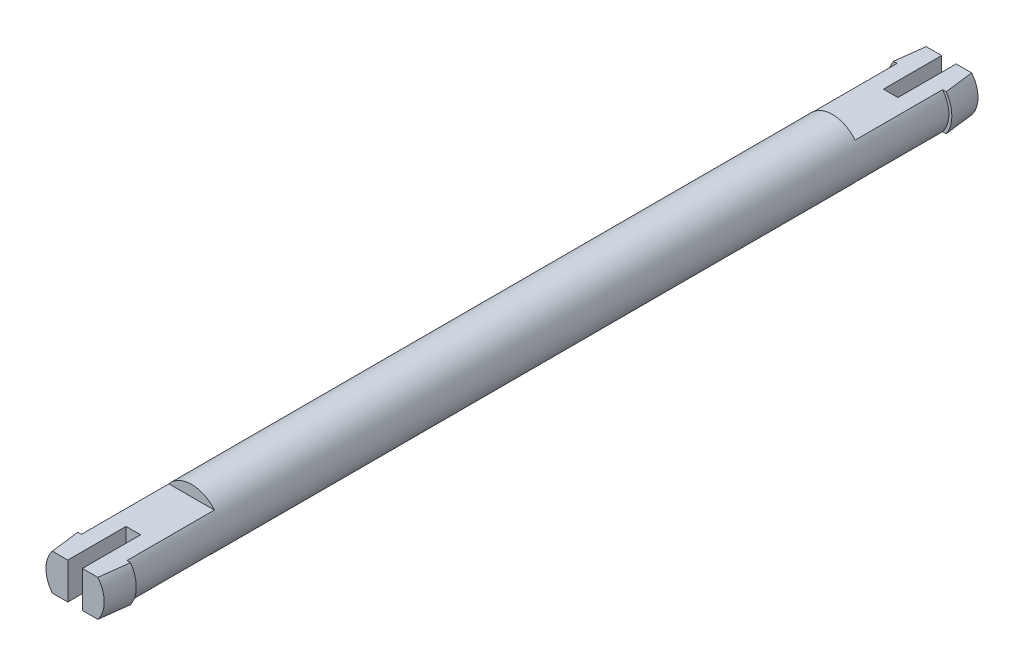
ISO-10303-21;
HEADER;
FILE_DESCRIPTION(('STEP AP214'),'2;1');
FILE_NAME('part.step','',(''),(''),'','','');
FILE_SCHEMA(('AUTOMOTIVE_DESIGN { 1 0 10303 214 1 1 1 1 }'));
ENDSEC;
DATA;
#1=APPLICATION_CONTEXT('core data for automotive mechanical design processes');
#2=APPLICATION_PROTOCOL_DEFINITION('international standard','automotive_design',2000,#1);
#3=PRODUCT_CONTEXT('',#1,'mechanical');
#4=PRODUCT('Part','Part','',(#3));
#5=PRODUCT_RELATED_PRODUCT_CATEGORY('part','',(#4));
#6=PRODUCT_DEFINITION_FORMATION('','',#4);
#7=PRODUCT_DEFINITION_CONTEXT('part definition',#1,'design');
#8=PRODUCT_DEFINITION('design','',#6,#7);
#9=PRODUCT_DEFINITION_SHAPE('','',#8);
#10=(LENGTH_UNIT() NAMED_UNIT(*) SI_UNIT(.MILLI.,.METRE.));
#11=(NAMED_UNIT(*) PLANE_ANGLE_UNIT() SI_UNIT($,.RADIAN.));
#12=(NAMED_UNIT(*) SI_UNIT($,.STERADIAN.) SOLID_ANGLE_UNIT());
#13=UNCERTAINTY_MEASURE_WITH_UNIT(LENGTH_MEASURE(1.E-05),#10,'distance_accuracy_value','');
#14=(GEOMETRIC_REPRESENTATION_CONTEXT(3) GLOBAL_UNCERTAINTY_ASSIGNED_CONTEXT((#13)) GLOBAL_UNIT_ASSIGNED_CONTEXT((#10,
#11,#12)) REPRESENTATION_CONTEXT('',''));
#15=CARTESIAN_POINT('',(0.,0.,0.));
#16=DIRECTION('',(0.,0.,1.));
#17=DIRECTION('',(1.,0.,0.));
#18=AXIS2_PLACEMENT_3D('',#15,#16,#17);
#19=CARTESIAN_POINT('',(0.,0.,-60.));
#20=DIRECTION('',(0.,0.,1.));
#21=DIRECTION('',(1.,0.,0.));
#22=AXIS2_PLACEMENT_3D('',#19,#20,#21);
#23=PLANE('',#22);
#24=DIRECTION('',(1.,0.,0.));
#25=VECTOR('',#24,1.);
#26=CARTESIAN_POINT('',(0.,1.25,-60.));
#27=LINE('',#26,#25);
#28=CARTESIAN_POINT('',(-1.5612494995996,1.25,-60.));
#29=VERTEX_POINT('',#28);
#30=CARTESIAN_POINT('',(-0.5,1.25,-60.));
#31=VERTEX_POINT('',#30);
#32=EDGE_CURVE('E420',#29,#31,#27,.T.);
#33=ORIENTED_EDGE('',*,*,#32,.T.);
#34=DIRECTION('',(0.,1.,0.));
#35=VECTOR('',#34,1.);
#36=CARTESIAN_POINT('',(-0.5,-2.,-60.));
#37=LINE('',#36,#35);
#38=CARTESIAN_POINT('',(-0.5,-1.25,-60.));
#39=VERTEX_POINT('',#38);
#40=EDGE_CURVE('E209',#39,#31,#37,.T.);
#41=ORIENTED_EDGE('',*,*,#40,.F.);
#42=DIRECTION('',(-1.,0.,0.));
#43=VECTOR('',#42,1.);
#44=CARTESIAN_POINT('',(0.,-1.25,-60.));
#45=LINE('',#44,#43);
#46=CARTESIAN_POINT('',(-1.5612494995996,-1.25,-60.));
#47=VERTEX_POINT('',#46);
#48=EDGE_CURVE('E62',#39,#47,#45,.T.);
#49=ORIENTED_EDGE('',*,*,#48,.T.);
#50=CARTESIAN_POINT('',(0.,0.,-60.));
#51=DIRECTION('',(0.,0.,1.));
#52=DIRECTION('',(1.,0.,0.));
#53=AXIS2_PLACEMENT_3D('',#50,#51,#52);
#54=CIRCLE('',#53,2.);
#55=EDGE_CURVE('E397',#29,#47,#54,.T.);
#56=ORIENTED_EDGE('',*,*,#55,.F.);
#57=EDGE_LOOP('',(#33,#41,#49,#56));
#58=FACE_BOUND('',#57,.T.);
#59=ADVANCED_FACE('F39',(#58),#23,.F.);
#60=CARTESIAN_POINT('',(0.,0.,-58.));
#61=DIRECTION('',(0.,0.,1.));
#62=DIRECTION('',(1.,0.,0.));
#63=AXIS2_PLACEMENT_3D('',#60,#61,#62);
#64=PLANE('',#63);
#65=DIRECTION('',(-1.,0.,0.));
#66=VECTOR('',#65,1.);
#67=CARTESIAN_POINT('',(0.,-1.25,-58.));
#68=LINE('',#67,#66);
#69=CARTESIAN_POINT('',(1.81038669902327,-1.25,-58.0000000000001));
#70=VERTEX_POINT('',#69);
#71=CARTESIAN_POINT('',(1.5612494995996,-1.25,-58.));
#72=VERTEX_POINT('',#71);
#73=EDGE_CURVE('E238',#70,#72,#68,.T.);
#74=ORIENTED_EDGE('',*,*,#73,.F.);
#75=CARTESIAN_POINT('',(0.,0.,-58.));
#76=DIRECTION('',(0.,0.,1.));
#77=DIRECTION('',(1.,0.,0.));
#78=AXIS2_PLACEMENT_3D('',#75,#76,#77);
#79=CIRCLE('',#78,2.2);
#80=CARTESIAN_POINT('',(1.81038669902327,1.25,-58.0000000000001));
#81=VERTEX_POINT('',#80);
#82=EDGE_CURVE('E291',#70,#81,#79,.T.);
#83=ORIENTED_EDGE('',*,*,#82,.T.);
#84=DIRECTION('',(1.,0.,0.));
#85=VECTOR('',#84,1.);
#86=CARTESIAN_POINT('',(0.,1.25,-58.));
#87=LINE('',#86,#85);
#88=CARTESIAN_POINT('',(1.5612494995996,1.25,-58.));
#89=VERTEX_POINT('',#88);
#90=EDGE_CURVE('E274',#89,#81,#87,.T.);
#91=ORIENTED_EDGE('',*,*,#90,.F.);
#92=CARTESIAN_POINT('',(0.,0.,-58.));
#93=DIRECTION('',(0.,0.,1.));
#94=DIRECTION('',(1.,0.,0.));
#95=AXIS2_PLACEMENT_3D('',#92,#93,#94);
#96=CIRCLE('',#95,2.);
#97=EDGE_CURVE('E417',#89,#72,#96,.F.);
#98=ORIENTED_EDGE('',*,*,#97,.T.);
#99=EDGE_LOOP('',(#74,#83,#91,#98));
#100=FACE_BOUND('',#99,.T.);
#101=ADVANCED_FACE('F461',(#100),#64,.T.);
#102=CARTESIAN_POINT('',(0.,0.,-58.));
#103=DIRECTION('',(0.,0.,1.));
#104=DIRECTION('',(1.,0.,0.));
#105=AXIS2_PLACEMENT_3D('',#102,#103,#104);
#106=CONICAL_SURFACE('',#105,2.2,0.0996686524911613);
#107=CARTESIAN_POINT('',(-2.07154781563105,-1.25,-55.8053511030935));
#108=CARTESIAN_POINT('',(-2.03550722726415,-1.25,-56.1139180179247));
#109=CARTESIAN_POINT('',(-1.99922295149764,-1.25,-56.4224563190549));
#110=CARTESIAN_POINT('',(-1.92607039278534,-1.25,-57.0394648246496));
#111=CARTESIAN_POINT('',(-1.88920210764817,-1.25,-57.3479350288541));
#112=CARTESIAN_POINT('',(-1.77758091435319,-1.25,-58.2731887554345));
#113=CARTESIAN_POINT('',(-1.70180760472734,-1.25,-58.889850372761));
#114=CARTESIAN_POINT('',(-1.58512147260779,-1.25,-59.8144760218349));
#115=CARTESIAN_POINT('',(-1.54572075887383,-1.25,-60.1226307817609));
#116=CARTESIAN_POINT('',(-1.46564062998624,-1.25,-60.73877265943));
#117=CARTESIAN_POINT('',(-1.42496122188892,-1.25,-61.0467597780885));
#118=CARTESIAN_POINT('',(-1.34198072748192,-1.25,-61.6625339402322));
#119=CARTESIAN_POINT('',(-1.29967955336675,-1.25,-61.9703209719642));
#120=CARTESIAN_POINT('',(-1.21285635248196,-1.25,-62.5855868834585));
#121=CARTESIAN_POINT('',(-1.16833428338409,-1.25,-62.8930657572336));
#122=CARTESIAN_POINT('',(-1.12240193199714,-1.25,-63.2003390005902));
#123=B_SPLINE_CURVE_WITH_KNOTS('',3,(#107,#108,#109,#110,#111,#112,#113,#114,#115,#116,#117,
#118,#119,#120,#121,#122),.UNSPECIFIED.,.F.,.F.,(4,2,2,2,2,2,2,4),(0.,0.931993165762316,
1.86398982945296,3.7278775087708,4.65986577266912,5.59184889439993,6.52388254692386,
7.45593396996271),.UNSPECIFIED.);
#124=CARTESIAN_POINT('',(-1.81038669902327,-1.25,-58.0000000000001));
#125=VERTEX_POINT('',#124);
#126=EDGE_CURVE('E255',#125,#47,#123,.T.);
#127=ORIENTED_EDGE('',*,*,#126,.F.);
#128=CARTESIAN_POINT('',(-1.81038669902327,1.25,-58.0000000000001));
#129=VERTEX_POINT('',#128);
#130=EDGE_CURVE('E292',#129,#125,#79,.T.);
#131=ORIENTED_EDGE('',*,*,#130,.F.);
#132=CARTESIAN_POINT('',(-1.12240193199714,1.25,-63.2003390005902));
#133=CARTESIAN_POINT('',(-1.16007318188192,1.25,-62.9484550212629));
#134=CARTESIAN_POINT('',(-1.19677568222069,1.25,-62.6964288561933));
#135=CARTESIAN_POINT('',(-1.26860770564258,1.25,-62.1921552657798));
#136=CARTESIAN_POINT('',(-1.30373724824444,1.25,-61.9399078432212));
#137=CARTESIAN_POINT('',(-1.37278762127905,1.25,-61.4352571718187));
#138=CARTESIAN_POINT('',(-1.40670849276505,1.25,-61.1828539285641));
#139=CARTESIAN_POINT('',(-1.47357063225507,1.25,-60.6779171395039));
#140=CARTESIAN_POINT('',(-1.50651189747343,1.25,-60.4253835933298));
#141=CARTESIAN_POINT('',(-1.56766910496902,1.25,-59.9506559350624));
#142=CARTESIAN_POINT('',(-1.59597605442952,1.25,-59.7284735200067));
#143=CARTESIAN_POINT('',(-1.66291250795864,1.25,-59.198043320873));
#144=CARTESIAN_POINT('',(-1.70129728585269,1.25,-58.8897646573885));
#145=CARTESIAN_POINT('',(-1.77723656698478,1.25,-58.2731045277543));
#146=CARTESIAN_POINT('',(-1.81479106820384,1.25,-57.9647230613564));
#147=CARTESIAN_POINT('',(-1.88921121609686,1.25,-57.3478817112025));
#148=CARTESIAN_POINT('',(-1.92607687286844,1.25,-57.0394218286632));
#149=CARTESIAN_POINT('',(-1.99922418459549,1.25,-56.4224342581659));
#150=CARTESIAN_POINT('',(-2.0355058422845,1.25,-56.1139065705321));
#151=CARTESIAN_POINT('',(-2.07154781563105,1.25,-55.8053511030935));
#152=B_SPLINE_CURVE_WITH_KNOTS('',3,(#132,#133,#134,#135,#136,#137,#138,#139,#140,#141,#142,
#143,#144,#145,#146,#147,#148,#149,#150,#151),.UNSPECIFIED.,.F.,.F.,(4,2,2,2,2,2,2,2,2,4),(0.,
0.764050536151596,1.52809158862137,2.29210666519175,3.05612391415669,3.72805834866274,
4.66003438385201,5.59201268506306,6.52397731386888,7.45593757911201),.UNSPECIFIED.);
#153=EDGE_CURVE('E281',#29,#129,#152,.T.);
#154=ORIENTED_EDGE('',*,*,#153,.F.);
#155=ORIENTED_EDGE('',*,*,#55,.T.);
#156=EDGE_LOOP('',(#127,#131,#154,#155));
#157=FACE_BOUND('',#156,.T.);
#158=ADVANCED_FACE('F465',(#157),#106,.T.);
#159=CARTESIAN_POINT('',(0.,0.,0.));
#160=DIRECTION('',(0.,0.,1.));
#161=DIRECTION('',(1.,0.,0.));
#162=AXIS2_PLACEMENT_3D('',#159,#160,#161);
#163=PLANE('',#162);
#164=DIRECTION('',(0.,-1.,0.));
#165=VECTOR('',#164,1.);
#166=CARTESIAN_POINT('',(-0.5,2.001,0.));
#167=LINE('',#166,#165);
#168=CARTESIAN_POINT('',(-0.5,1.25,0.));
#169=VERTEX_POINT('',#168);
#170=CARTESIAN_POINT('',(-0.5,-1.25,0.));
#171=VERTEX_POINT('',#170);
#172=EDGE_CURVE('E308',#169,#171,#167,.T.);
#173=ORIENTED_EDGE('',*,*,#172,.F.);
#174=DIRECTION('',(1.,0.,0.));
#175=VECTOR('',#174,1.);
#176=CARTESIAN_POINT('',(0.,1.25,0.));
#177=LINE('',#176,#175);
#178=CARTESIAN_POINT('',(-1.5612494995996,1.25,0.));
#179=VERTEX_POINT('',#178);
#180=EDGE_CURVE('E411',#179,#169,#177,.T.);
#181=ORIENTED_EDGE('',*,*,#180,.F.);
#182=CARTESIAN_POINT('',(0.,0.,0.));
#183=DIRECTION('',(0.,0.,1.));
#184=DIRECTION('',(1.,0.,0.));
#185=AXIS2_PLACEMENT_3D('',#182,#183,#184);
#186=CIRCLE('',#185,2.);
#187=CARTESIAN_POINT('',(-1.5612494995996,-1.25,0.));
#188=VERTEX_POINT('',#187);
#189=EDGE_CURVE('E392',#179,#188,#186,.T.);
#190=ORIENTED_EDGE('',*,*,#189,.T.);
#191=DIRECTION('',(-1.,0.,0.));
#192=VECTOR('',#191,1.);
#193=CARTESIAN_POINT('',(0.,-1.25,0.));
#194=LINE('',#193,#192);
#195=EDGE_CURVE('E404',#171,#188,#194,.T.);
#196=ORIENTED_EDGE('',*,*,#195,.F.);
#197=EDGE_LOOP('',(#173,#181,#190,#196));
#198=FACE_BOUND('',#197,.T.);
#199=ADVANCED_FACE('F476',(#198),#163,.T.);
#200=CARTESIAN_POINT('',(0.,0.,0.));
#201=DIRECTION('',(0.,0.,-1.));
#202=DIRECTION('',(-1.,0.,0.));
#203=AXIS2_PLACEMENT_3D('',#200,#201,#202);
#204=CONICAL_SURFACE('',#203,2.,0.0996686524911612);
#205=CARTESIAN_POINT('',(-2.20629085167544,1.25,-5.35787712366069));
#206=CARTESIAN_POINT('',(-2.16911364127435,1.25,-5.03442418142203));
#207=CARTESIAN_POINT('',(-2.13171451989948,1.25,-4.71099685663596));
#208=CARTESIAN_POINT('',(-2.05638780976397,1.25,-4.06420290953939));
#209=CARTESIAN_POINT('',(-2.01846021960565,1.25,-3.74083628739171));
#210=CARTESIAN_POINT('',(-1.90376109024389,1.25,-2.77086975377676));
#211=CARTESIAN_POINT('',(-1.82607027221003,1.25,-2.12437765306016));
#212=CARTESIAN_POINT('',(-1.70685435031514,1.25,-1.15495865945316));
#213=CARTESIAN_POINT('',(-1.6666684414073,1.25,-0.831867113806437));
#214=CARTESIAN_POINT('',(-1.58517894557185,1.25,-0.185825927060357));
#215=CARTESIAN_POINT('',(-1.54387536251856,1.25,0.137123714526958));
#216=CARTESIAN_POINT('',(-1.45986916908057,1.25,0.782854266012029));
#217=CARTESIAN_POINT('',(-1.41716650618307,1.25,1.10563516911336));
#218=CARTESIAN_POINT('',(-1.32989270639121,1.25,1.75094775860943));
#219=CARTESIAN_POINT('',(-1.28532154707356,1.25,2.07347944196603));
#220=CARTESIAN_POINT('',(-1.23958118370651,1.25,2.39584846975234));
#221=B_SPLINE_CURVE_WITH_KNOTS('',3,(#205,#206,#207,#208,#209,#210,#211,#212,#213,#214,#215,
#216,#217,#218,#219,#220),.UNSPECIFIED.,.F.,.F.,(4,2,2,2,2,2,2,4),(0.,0.976747065340103,
1.95349671443936,3.90691894725974,4.88366075798535,5.86039918335277,6.83717431153944,
7.81396116508773),.UNSPECIFIED.);
#222=CARTESIAN_POINT('',(-1.81038669902317,1.25,-2.));
#223=VERTEX_POINT('',#222);
#224=EDGE_CURVE('E324',#223,#179,#221,.T.);
#225=ORIENTED_EDGE('',*,*,#224,.F.);
#226=CARTESIAN_POINT('',(0.,0.,-2.));
#227=DIRECTION('',(0.,0.,1.));
#228=DIRECTION('',(1.,0.,0.));
#229=AXIS2_PLACEMENT_3D('',#226,#227,#228);
#230=CIRCLE('',#229,2.2);
#231=CARTESIAN_POINT('',(-1.81038669902317,-1.25,-2.));
#232=VERTEX_POINT('',#231);
#233=EDGE_CURVE('E388',#223,#232,#230,.T.);
#234=ORIENTED_EDGE('',*,*,#233,.T.);
#235=CARTESIAN_POINT('',(-1.23958118370651,-1.25,2.39584846975234));
#236=CARTESIAN_POINT('',(-1.27708445163936,-1.25,2.1316265009786));
#237=CARTESIAN_POINT('',(-1.31378723609279,-1.25,1.86729257599781));
#238=CARTESIAN_POINT('',(-1.38587498011765,-1.25,1.33844690886303));
#239=CARTESIAN_POINT('',(-1.42125994975576,-1.25,1.07393516808307));
#240=CARTESIAN_POINT('',(-1.49099498681418,-1.25,0.544781873474838));
#241=CARTESIAN_POINT('',(-1.5253450774814,-1.25,0.280140322698454));
#242=CARTESIAN_POINT('',(-1.59319606726225,-1.25,-0.249251984131472));
#243=CARTESIAN_POINT('',(-1.62669696491898,-1.25,-0.514002740371576));
#244=CARTESIAN_POINT('',(-1.68902097967955,-1.25,-1.01186777884924));
#245=CARTESIAN_POINT('',(-1.71792365975446,-1.25,-1.24497212268678));
#246=CARTESIAN_POINT('',(-1.8260728146173,-1.25,-2.12439276505839));
#247=CARTESIAN_POINT('',(-1.90376491575885,-1.25,-2.77090043818358));
#248=CARTESIAN_POINT('',(-2.01846468029956,-1.25,-3.74087483946421));
#249=CARTESIAN_POINT('',(-2.056391393145,-1.25,-4.06423386196728));
#250=CARTESIAN_POINT('',(-2.13171635303436,-1.25,-4.71101241305846));
#251=CARTESIAN_POINT('',(-2.16911460179215,-1.25,-5.03443194144689));
#252=CARTESIAN_POINT('',(-2.20629085167544,-1.25,-5.35787712366069));
#253=B_SPLINE_CURVE_WITH_KNOTS('',3,(#235,#236,#237,#238,#239,#240,#241,#242,#243,#244,#245,
#246,#247,#248,#249,#250,#251,#252),.UNSPECIFIED.,.F.,.F.,(4,2,2,2,2,2,2,2,4),(0.,
0.800607232202053,1.60120834737589,2.40179146488677,3.2023759557953,3.90704351295182,
5.86051217913123,6.83723890380335,7.81396246011894),.UNSPECIFIED.);
#254=EDGE_CURVE('E379',#188,#232,#253,.T.);
#255=ORIENTED_EDGE('',*,*,#254,.F.);
#256=ORIENTED_EDGE('',*,*,#189,.F.);
#257=EDGE_LOOP('',(#225,#234,#255,#256));
#258=FACE_BOUND('',#257,.T.);
#259=ADVANCED_FACE('F481',(#258),#204,.T.);
#260=CARTESIAN_POINT('',(0.,0.,-2.));
#261=DIRECTION('',(0.,0.,-1.));
#262=DIRECTION('',(-1.,0.,0.));
#263=AXIS2_PLACEMENT_3D('',#260,#261,#262);
#264=PLANE('',#263);
#265=DIRECTION('',(-1.,0.,0.));
#266=VECTOR('',#265,1.);
#267=CARTESIAN_POINT('',(0.,1.25,-2.));
#268=LINE('',#267,#266);
#269=CARTESIAN_POINT('',(1.81038669902317,1.25,-2.));
#270=VERTEX_POINT('',#269);
#271=CARTESIAN_POINT('',(1.5612494995996,1.25,-2.));
#272=VERTEX_POINT('',#271);
#273=EDGE_CURVE('E325',#270,#272,#268,.T.);
#274=ORIENTED_EDGE('',*,*,#273,.F.);
#275=CARTESIAN_POINT('',(1.81038669902317,-1.25,-2.));
#276=VERTEX_POINT('',#275);
#277=EDGE_CURVE('E389',#276,#270,#230,.T.);
#278=ORIENTED_EDGE('',*,*,#277,.F.);
#279=DIRECTION('',(1.,0.,0.));
#280=VECTOR('',#279,1.);
#281=CARTESIAN_POINT('',(0.,-1.25,-2.));
#282=LINE('',#281,#280);
#283=CARTESIAN_POINT('',(1.5612494995996,-1.25,-2.));
#284=VERTEX_POINT('',#283);
#285=EDGE_CURVE('E361',#284,#276,#282,.T.);
#286=ORIENTED_EDGE('',*,*,#285,.F.);
#287=CARTESIAN_POINT('',(0.,0.,-2.));
#288=DIRECTION('',(0.,0.,-1.));
#289=DIRECTION('',(-1.,0.,0.));
#290=AXIS2_PLACEMENT_3D('',#287,#288,#289);
#291=CIRCLE('',#290,2.);
#292=EDGE_CURVE('E401',#284,#272,#291,.F.);
#293=ORIENTED_EDGE('',*,*,#292,.T.);
#294=EDGE_LOOP('',(#274,#278,#286,#293));
#295=FACE_BOUND('',#294,.T.);
#296=ADVANCED_FACE('F562',(#295),#264,.T.);
#297=CARTESIAN_POINT('',(0.,0.,-60.));
#298=DIRECTION('',(0.,0.,1.));
#299=DIRECTION('',(1.,0.,0.));
#300=AXIS2_PLACEMENT_3D('',#297,#298,#299);
#301=CYLINDRICAL_SURFACE('',#300,2.);
#302=DIRECTION('',(0.,0.,1.));
#303=VECTOR('',#302,1.);
#304=CARTESIAN_POINT('',(-1.5612494995996,-1.25,-60.));
#305=LINE('',#304,#303);
#306=CARTESIAN_POINT('',(-1.5612494995996,-1.25,-52.));
#307=VERTEX_POINT('',#306);
#308=CARTESIAN_POINT('',(-1.5612494995996,-1.25,-58.));
#309=VERTEX_POINT('',#308);
#310=EDGE_CURVE('E263',#307,#309,#305,.F.);
#311=ORIENTED_EDGE('',*,*,#310,.F.);
#312=CARTESIAN_POINT('',(0.,0.,-52.));
#313=DIRECTION('',(0.,0.,-1.));
#314=DIRECTION('',(-1.,0.,0.));
#315=AXIS2_PLACEMENT_3D('',#312,#313,#314);
#316=CIRCLE('',#315,2.);
#317=CARTESIAN_POINT('',(1.5612494995996,-1.25,-52.));
#318=VERTEX_POINT('',#317);
#319=EDGE_CURVE('E428',#307,#318,#316,.F.);
#320=ORIENTED_EDGE('',*,*,#319,.T.);
#321=DIRECTION('',(0.,0.,1.));
#322=VECTOR('',#321,1.);
#323=CARTESIAN_POINT('',(1.5612494995996,-1.25,-60.));
#324=LINE('',#323,#322);
#325=EDGE_CURVE('E262',#72,#318,#324,.T.);
#326=ORIENTED_EDGE('',*,*,#325,.F.);
#327=ORIENTED_EDGE('',*,*,#97,.F.);
#328=DIRECTION('',(0.,0.,1.));
#329=VECTOR('',#328,1.);
#330=CARTESIAN_POINT('',(1.5612494995996,1.25,-60.));
#331=LINE('',#330,#329);
#332=CARTESIAN_POINT('',(1.5612494995996,1.25,-52.));
#333=VERTEX_POINT('',#332);
#334=EDGE_CURVE('E288',#333,#89,#331,.F.);
#335=ORIENTED_EDGE('',*,*,#334,.F.);
#336=CARTESIAN_POINT('',(0.,0.,-52.));
#337=DIRECTION('',(0.,0.,1.));
#338=DIRECTION('',(1.,0.,0.));
#339=AXIS2_PLACEMENT_3D('',#336,#337,#338);
#340=CIRCLE('',#339,2.);
#341=CARTESIAN_POINT('',(-1.5612494995996,1.25,-52.));
#342=VERTEX_POINT('',#341);
#343=EDGE_CURVE('E423',#342,#333,#340,.F.);
#344=ORIENTED_EDGE('',*,*,#343,.F.);
#345=DIRECTION('',(0.,0.,1.));
#346=VECTOR('',#345,1.);
#347=CARTESIAN_POINT('',(-1.5612494995996,1.25,-60.));
#348=LINE('',#347,#346);
#349=CARTESIAN_POINT('',(-1.5612494995996,1.25,-58.));
#350=VERTEX_POINT('',#349);
#351=EDGE_CURVE('E289',#350,#342,#348,.T.);
#352=ORIENTED_EDGE('',*,*,#351,.F.);
#353=EDGE_CURVE('E416',#309,#350,#96,.F.);
#354=ORIENTED_EDGE('',*,*,#353,.F.);
#355=EDGE_LOOP('',(#311,#320,#326,#327,#335,#344,#352,#354));
#356=FACE_BOUND('',#355,.T.);
#357=DIRECTION('',(0.,0.,1.));
#358=VECTOR('',#357,1.);
#359=CARTESIAN_POINT('',(1.5612494995996,1.25,-60.));
#360=LINE('',#359,#358);
#361=CARTESIAN_POINT('',(1.5612494995996,1.25,-8.));
#362=VERTEX_POINT('',#361);
#363=EDGE_CURVE('E356',#272,#362,#360,.F.);
#364=ORIENTED_EDGE('',*,*,#363,.F.);
#365=ORIENTED_EDGE('',*,*,#292,.F.);
#366=DIRECTION('',(0.,0.,1.));
#367=VECTOR('',#366,1.);
#368=CARTESIAN_POINT('',(1.5612494995996,-1.25,-60.));
#369=LINE('',#368,#367);
#370=CARTESIAN_POINT('',(1.5612494995996,-1.25,-8.));
#371=VERTEX_POINT('',#370);
#372=EDGE_CURVE('E370',#371,#284,#369,.T.);
#373=ORIENTED_EDGE('',*,*,#372,.F.);
#374=CARTESIAN_POINT('',(0.,0.,-8.));
#375=DIRECTION('',(0.,0.,-1.));
#376=DIRECTION('',(-1.,0.,0.));
#377=AXIS2_PLACEMENT_3D('',#374,#375,#376);
#378=CIRCLE('',#377,2.);
#379=CARTESIAN_POINT('',(-1.5612494995996,-1.25,-8.));
#380=VERTEX_POINT('',#379);
#381=EDGE_CURVE('E408',#380,#371,#378,.F.);
#382=ORIENTED_EDGE('',*,*,#381,.F.);
#383=DIRECTION('',(0.,0.,1.));
#384=VECTOR('',#383,1.);
#385=CARTESIAN_POINT('',(-1.5612494995996,-1.25,-60.));
#386=LINE('',#385,#384);
#387=CARTESIAN_POINT('',(-1.5612494995996,-1.25,-2.));
#388=VERTEX_POINT('',#387);
#389=EDGE_CURVE('E386',#388,#380,#386,.F.);
#390=ORIENTED_EDGE('',*,*,#389,.F.);
#391=CARTESIAN_POINT('',(-1.5612494995996,1.25,-2.));
#392=VERTEX_POINT('',#391);
#393=EDGE_CURVE('E400',#392,#388,#291,.F.);
#394=ORIENTED_EDGE('',*,*,#393,.F.);
#395=DIRECTION('',(0.,0.,1.));
#396=VECTOR('',#395,1.);
#397=CARTESIAN_POINT('',(-1.5612494995996,1.25,-60.));
#398=LINE('',#397,#396);
#399=CARTESIAN_POINT('',(-1.5612494995996,1.25,-8.));
#400=VERTEX_POINT('',#399);
#401=EDGE_CURVE('E333',#400,#392,#398,.T.);
#402=ORIENTED_EDGE('',*,*,#401,.F.);
#403=CARTESIAN_POINT('',(0.,0.,-8.));
#404=DIRECTION('',(0.,0.,-1.));
#405=DIRECTION('',(-1.,0.,0.));
#406=AXIS2_PLACEMENT_3D('',#403,#404,#405);
#407=CIRCLE('',#406,2.);
#408=EDGE_CURVE('E414',#362,#400,#407,.F.);
#409=ORIENTED_EDGE('',*,*,#408,.F.);
#410=EDGE_LOOP('',(#364,#365,#373,#382,#390,#394,#402,#409));
#411=FACE_BOUND('',#410,.T.);
#412=ADVANCED_FACE('F41',(#356,#411),#301,.T.);
#413=CARTESIAN_POINT('',(1.23958118370651,1.25,2.39584846975234));
#414=CARTESIAN_POINT('',(1.27708445163936,1.25,2.1316265009786));
#415=CARTESIAN_POINT('',(1.31378723609279,1.25,1.86729257599781));
#416=CARTESIAN_POINT('',(1.38587498011765,1.25,1.33844690886303));
#417=CARTESIAN_POINT('',(1.42125994975576,1.25,1.07393516808307));
#418=CARTESIAN_POINT('',(1.49099498681418,1.25,0.544781873474838));
#419=CARTESIAN_POINT('',(1.5253450774814,1.25,0.280140322698454));
#420=CARTESIAN_POINT('',(1.59319606726225,1.25,-0.249251984131472));
#421=CARTESIAN_POINT('',(1.62669696491898,1.25,-0.514002740371576));
#422=CARTESIAN_POINT('',(1.68902097967955,1.25,-1.01186777884924));
#423=CARTESIAN_POINT('',(1.71792365975446,1.25,-1.24497212268678));
#424=CARTESIAN_POINT('',(1.8260728146173,1.25,-2.12439276505839));
#425=CARTESIAN_POINT('',(1.90376491575885,1.25,-2.77090043818358));
#426=CARTESIAN_POINT('',(2.01846468029956,1.25,-3.74087483946421));
#427=CARTESIAN_POINT('',(2.056391393145,1.25,-4.06423386196728));
#428=CARTESIAN_POINT('',(2.13171635303436,1.25,-4.71101241305846));
#429=CARTESIAN_POINT('',(2.16911460179215,1.25,-5.03443194144689));
#430=CARTESIAN_POINT('',(2.20629085167544,1.25,-5.35787712366069));
#431=B_SPLINE_CURVE_WITH_KNOTS('',3,(#413,#414,#415,#416,#417,#418,#419,#420,#421,#422,#423,
#424,#425,#426,#427,#428,#429,#430),.UNSPECIFIED.,.F.,.F.,(4,2,2,2,2,2,2,2,4),(0.,
0.800607232202053,1.60120834737589,2.40179146488677,3.2023759557953,3.90704351295182,
5.86051217913123,6.83723890380335,7.81396246011894),.UNSPECIFIED.);
#432=CARTESIAN_POINT('',(1.5612494995996,1.25,0.));
#433=VERTEX_POINT('',#432);
#434=EDGE_CURVE('E350',#433,#270,#431,.T.);
#435=ORIENTED_EDGE('',*,*,#434,.F.);
#436=CARTESIAN_POINT('',(1.5612494995996,-1.25,0.));
#437=VERTEX_POINT('',#436);
#438=EDGE_CURVE('E393',#437,#433,#186,.T.);
#439=ORIENTED_EDGE('',*,*,#438,.F.);
#440=CARTESIAN_POINT('',(2.20629085167544,-1.25,-5.35787712366069));
#441=CARTESIAN_POINT('',(2.16911364127435,-1.25,-5.03442418142203));
#442=CARTESIAN_POINT('',(2.13171451989948,-1.25,-4.71099685663596));
#443=CARTESIAN_POINT('',(2.05638780976397,-1.25,-4.06420290953939));
#444=CARTESIAN_POINT('',(2.01846021960565,-1.25,-3.74083628739171));
#445=CARTESIAN_POINT('',(1.90376109024389,-1.25,-2.77086975377676));
#446=CARTESIAN_POINT('',(1.82607027221003,-1.25,-2.12437765306016));
#447=CARTESIAN_POINT('',(1.70685435031514,-1.25,-1.15495865945316));
#448=CARTESIAN_POINT('',(1.6666684414073,-1.25,-0.831867113806437));
#449=CARTESIAN_POINT('',(1.58517894557185,-1.25,-0.185825927060357));
#450=CARTESIAN_POINT('',(1.54387536251856,-1.25,0.137123714526958));
#451=CARTESIAN_POINT('',(1.45986916908057,-1.25,0.782854266012029));
#452=CARTESIAN_POINT('',(1.41716650618307,-1.25,1.10563516911336));
#453=CARTESIAN_POINT('',(1.32989270639121,-1.25,1.75094775860943));
#454=CARTESIAN_POINT('',(1.28532154707356,-1.25,2.07347944196603));
#455=CARTESIAN_POINT('',(1.23958118370651,-1.25,2.39584846975234));
#456=B_SPLINE_CURVE_WITH_KNOTS('',3,(#440,#441,#442,#443,#444,#445,#446,#447,#448,#449,#450,
#451,#452,#453,#454,#455),.UNSPECIFIED.,.F.,.F.,(4,2,2,2,2,2,2,4),(0.,0.976747065340103,
1.95349671443936,3.90691894725974,4.88366075798535,5.86039918335277,6.83717431153944,
7.81396116508773),.UNSPECIFIED.);
#457=EDGE_CURVE('E363',#276,#437,#456,.T.);
#458=ORIENTED_EDGE('',*,*,#457,.F.);
#459=ORIENTED_EDGE('',*,*,#277,.T.);
#460=EDGE_LOOP('',(#435,#439,#458,#459));
#461=FACE_BOUND('',#460,.T.);
#462=ADVANCED_FACE('F335',(#461),#204,.T.);
#463=EDGE_CURVE('E322',#392,#223,#268,.T.);
#464=ORIENTED_EDGE('',*,*,#463,.F.);
#465=ORIENTED_EDGE('',*,*,#393,.T.);
#466=EDGE_CURVE('E364',#232,#388,#282,.T.);
#467=ORIENTED_EDGE('',*,*,#466,.F.);
#468=ORIENTED_EDGE('',*,*,#233,.F.);
#469=EDGE_LOOP('',(#464,#465,#467,#468));
#470=FACE_BOUND('',#469,.T.);
#471=ADVANCED_FACE('F377',(#470),#264,.T.);
#472=DIRECTION('',(0.,-1.,0.));
#473=VECTOR('',#472,1.);
#474=CARTESIAN_POINT('',(0.5,2.001,0.));
#475=LINE('',#474,#473);
#476=CARTESIAN_POINT('',(0.5,1.25,0.));
#477=VERTEX_POINT('',#476);
#478=CARTESIAN_POINT('',(0.5,-1.25,0.));
#479=VERTEX_POINT('',#478);
#480=EDGE_CURVE('E311',#477,#479,#475,.T.);
#481=ORIENTED_EDGE('',*,*,#480,.T.);
#482=EDGE_CURVE('E405',#437,#479,#194,.T.);
#483=ORIENTED_EDGE('',*,*,#482,.F.);
#484=ORIENTED_EDGE('',*,*,#438,.T.);
#485=EDGE_CURVE('E410',#477,#433,#177,.T.);
#486=ORIENTED_EDGE('',*,*,#485,.F.);
#487=EDGE_LOOP('',(#481,#483,#484,#486));
#488=FACE_BOUND('',#487,.T.);
#489=ADVANCED_FACE('F375',(#488),#163,.T.);
#490=CARTESIAN_POINT('',(-2.1,-1.25,-8.));
#491=DIRECTION('',(0.,1.,0.));
#492=DIRECTION('',(0.,0.,1.));
#493=AXIS2_PLACEMENT_3D('',#490,#491,#492);
#494=PLANE('',#493);
#495=DIRECTION('',(1.,0.,0.));
#496=VECTOR('',#495,1.);
#497=CARTESIAN_POINT('',(-0.5,-1.25,-4.));
#498=LINE('',#497,#496);
#499=CARTESIAN_POINT('',(-0.5,-1.25,-4.));
#500=VERTEX_POINT('',#499);
#501=CARTESIAN_POINT('',(0.5,-1.25,-4.));
#502=VERTEX_POINT('',#501);
#503=EDGE_CURVE('E302',#500,#502,#498,.T.);
#504=ORIENTED_EDGE('',*,*,#503,.F.);
#505=DIRECTION('',(0.,0.,-1.));
#506=VECTOR('',#505,1.);
#507=CARTESIAN_POINT('',(-0.5,-1.25,0.));
#508=LINE('',#507,#506);
#509=EDGE_CURVE('E299',#171,#500,#508,.T.);
#510=ORIENTED_EDGE('',*,*,#509,.F.);
#511=ORIENTED_EDGE('',*,*,#195,.T.);
#512=ORIENTED_EDGE('',*,*,#254,.T.);
#513=ORIENTED_EDGE('',*,*,#466,.T.);
#514=ORIENTED_EDGE('',*,*,#389,.T.);
#515=DIRECTION('',(-1.,0.,0.));
#516=VECTOR('',#515,1.);
#517=CARTESIAN_POINT('',(-2.1,-1.25,-8.));
#518=LINE('',#517,#516);
#519=EDGE_CURVE('E358',#371,#380,#518,.T.);
#520=ORIENTED_EDGE('',*,*,#519,.F.);
#521=ORIENTED_EDGE('',*,*,#372,.T.);
#522=ORIENTED_EDGE('',*,*,#285,.T.);
#523=ORIENTED_EDGE('',*,*,#457,.T.);
#524=ORIENTED_EDGE('',*,*,#482,.T.);
#525=DIRECTION('',(0.,0.,1.));
#526=VECTOR('',#525,1.);
#527=CARTESIAN_POINT('',(0.5,-1.25,0.));
#528=LINE('',#527,#526);
#529=EDGE_CURVE('E305',#502,#479,#528,.T.);
#530=ORIENTED_EDGE('',*,*,#529,.F.);
#531=EDGE_LOOP('',(#504,#510,#511,#512,#513,#514,#520,#521,#522,#523,#524,#530));
#532=FACE_BOUND('',#531,.T.);
#533=ADVANCED_FACE('F372',(#532),#494,.F.);
#534=CARTESIAN_POINT('',(-2.1,-1.25,-8.));
#535=DIRECTION('',(0.,0.,-1.));
#536=DIRECTION('',(-1.,0.,0.));
#537=AXIS2_PLACEMENT_3D('',#534,#535,#536);
#538=PLANE('',#537);
#539=ORIENTED_EDGE('',*,*,#381,.T.);
#540=ORIENTED_EDGE('',*,*,#519,.T.);
#541=EDGE_LOOP('',(#539,#540));
#542=FACE_BOUND('',#541,.T.);
#543=ADVANCED_FACE('F345',(#542),#538,.F.);
#544=CARTESIAN_POINT('',(-2.1,1.25,-8.));
#545=DIRECTION('',(0.,-1.,0.));
#546=DIRECTION('',(0.,0.,-1.));
#547=AXIS2_PLACEMENT_3D('',#544,#545,#546);
#548=PLANE('',#547);
#549=ORIENTED_EDGE('',*,*,#180,.T.);
#550=DIRECTION('',(0.,0.,1.));
#551=VECTOR('',#550,1.);
#552=CARTESIAN_POINT('',(-0.5,1.25,0.));
#553=LINE('',#552,#551);
#554=CARTESIAN_POINT('',(-0.5,1.25,-4.));
#555=VERTEX_POINT('',#554);
#556=EDGE_CURVE('E297',#555,#169,#553,.T.);
#557=ORIENTED_EDGE('',*,*,#556,.F.);
#558=DIRECTION('',(-1.,0.,0.));
#559=VECTOR('',#558,1.);
#560=CARTESIAN_POINT('',(-0.5,1.25,-4.));
#561=LINE('',#560,#559);
#562=CARTESIAN_POINT('',(0.5,1.25,-4.));
#563=VERTEX_POINT('',#562);
#564=EDGE_CURVE('E310',#563,#555,#561,.T.);
#565=ORIENTED_EDGE('',*,*,#564,.F.);
#566=DIRECTION('',(0.,0.,-1.));
#567=VECTOR('',#566,1.);
#568=CARTESIAN_POINT('',(0.5,1.25,0.));
#569=LINE('',#568,#567);
#570=EDGE_CURVE('E295',#477,#563,#569,.T.);
#571=ORIENTED_EDGE('',*,*,#570,.F.);
#572=ORIENTED_EDGE('',*,*,#485,.T.);
#573=ORIENTED_EDGE('',*,*,#434,.T.);
#574=ORIENTED_EDGE('',*,*,#273,.T.);
#575=ORIENTED_EDGE('',*,*,#363,.T.);
#576=DIRECTION('',(1.,0.,0.));
#577=VECTOR('',#576,1.);
#578=CARTESIAN_POINT('',(-2.1,1.25,-8.));
#579=LINE('',#578,#577);
#580=EDGE_CURVE('E319',#400,#362,#579,.T.);
#581=ORIENTED_EDGE('',*,*,#580,.F.);
#582=ORIENTED_EDGE('',*,*,#401,.T.);
#583=ORIENTED_EDGE('',*,*,#463,.T.);
#584=ORIENTED_EDGE('',*,*,#224,.T.);
#585=EDGE_LOOP('',(#549,#557,#565,#571,#572,#573,#574,#575,#581,#582,#583,#584));
#586=FACE_BOUND('',#585,.T.);
#587=ADVANCED_FACE('F339',(#586),#548,.F.);
#588=CARTESIAN_POINT('',(2.1,2.25,-8.));
#589=DIRECTION('',(0.,0.,-1.));
#590=DIRECTION('',(-1.,0.,0.));
#591=AXIS2_PLACEMENT_3D('',#588,#589,#590);
#592=PLANE('',#591);
#593=ORIENTED_EDGE('',*,*,#408,.T.);
#594=ORIENTED_EDGE('',*,*,#580,.T.);
#595=EDGE_LOOP('',(#593,#594));
#596=FACE_BOUND('',#595,.T.);
#597=ADVANCED_FACE('F344',(#596),#592,.F.);
#598=CARTESIAN_POINT('',(-0.5,2.001,0.));
#599=DIRECTION('',(-1.,0.,0.));
#600=DIRECTION('',(0.,0.,1.));
#601=AXIS2_PLACEMENT_3D('',#598,#599,#600);
#602=PLANE('',#601);
#603=ORIENTED_EDGE('',*,*,#556,.T.);
#604=ORIENTED_EDGE('',*,*,#172,.T.);
#605=ORIENTED_EDGE('',*,*,#509,.T.);
#606=DIRECTION('',(0.,-1.,0.));
#607=VECTOR('',#606,1.);
#608=CARTESIAN_POINT('',(-0.5,2.001,-4.));
#609=LINE('',#608,#607);
#610=EDGE_CURVE('E307',#555,#500,#609,.T.);
#611=ORIENTED_EDGE('',*,*,#610,.F.);
#612=EDGE_LOOP('',(#603,#604,#605,#611));
#613=FACE_BOUND('',#612,.T.);
#614=ADVANCED_FACE('F589',(#613),#602,.F.);
#615=CARTESIAN_POINT('',(0.5,2.001,0.));
#616=DIRECTION('',(1.,0.,0.));
#617=DIRECTION('',(0.,0.,-1.));
#618=AXIS2_PLACEMENT_3D('',#615,#616,#617);
#619=PLANE('',#618);
#620=ORIENTED_EDGE('',*,*,#570,.T.);
#621=DIRECTION('',(0.,-1.,0.));
#622=VECTOR('',#621,1.);
#623=CARTESIAN_POINT('',(0.5,2.001,-4.));
#624=LINE('',#623,#622);
#625=EDGE_CURVE('E314',#563,#502,#624,.T.);
#626=ORIENTED_EDGE('',*,*,#625,.T.);
#627=ORIENTED_EDGE('',*,*,#529,.T.);
#628=ORIENTED_EDGE('',*,*,#480,.F.);
#629=EDGE_LOOP('',(#620,#626,#627,#628));
#630=FACE_BOUND('',#629,.T.);
#631=ADVANCED_FACE('F579',(#630),#619,.F.);
#632=CARTESIAN_POINT('',(-0.5,2.001,-4.));
#633=DIRECTION('',(0.,0.,-1.));
#634=DIRECTION('',(-1.,0.,0.));
#635=AXIS2_PLACEMENT_3D('',#632,#633,#634);
#636=PLANE('',#635);
#637=ORIENTED_EDGE('',*,*,#564,.T.);
#638=ORIENTED_EDGE('',*,*,#610,.T.);
#639=ORIENTED_EDGE('',*,*,#503,.T.);
#640=ORIENTED_EDGE('',*,*,#625,.F.);
#641=EDGE_LOOP('',(#637,#638,#639,#640));
#642=FACE_BOUND('',#641,.T.);
#643=ADVANCED_FACE('F474',(#642),#636,.F.);
#644=EDGE_CURVE('E261',#309,#125,#68,.T.);
#645=ORIENTED_EDGE('',*,*,#644,.F.);
#646=ORIENTED_EDGE('',*,*,#353,.T.);
#647=EDGE_CURVE('E287',#129,#350,#87,.T.);
#648=ORIENTED_EDGE('',*,*,#647,.F.);
#649=ORIENTED_EDGE('',*,*,#130,.T.);
#650=EDGE_LOOP('',(#645,#646,#648,#649));
#651=FACE_BOUND('',#650,.T.);
#652=ADVANCED_FACE('F466',(#651),#64,.T.);
#653=CARTESIAN_POINT('',(1.12240193199714,-1.25,-63.2003390005902));
#654=CARTESIAN_POINT('',(1.16007318188192,-1.25,-62.9484550212629));
#655=CARTESIAN_POINT('',(1.19677568222069,-1.25,-62.6964288561933));
#656=CARTESIAN_POINT('',(1.26860770564258,-1.25,-62.1921552657798));
#657=CARTESIAN_POINT('',(1.30373724824444,-1.25,-61.9399078432212));
#658=CARTESIAN_POINT('',(1.37278762127905,-1.25,-61.4352571718187));
#659=CARTESIAN_POINT('',(1.40670849276505,-1.25,-61.1828539285641));
#660=CARTESIAN_POINT('',(1.47357063225507,-1.25,-60.6779171395039));
#661=CARTESIAN_POINT('',(1.50651189747343,-1.25,-60.4253835933298));
#662=CARTESIAN_POINT('',(1.56766910496902,-1.25,-59.9506559350624));
#663=CARTESIAN_POINT('',(1.59597605442952,-1.25,-59.7284735200067));
#664=CARTESIAN_POINT('',(1.66291250795864,-1.25,-59.198043320873));
#665=CARTESIAN_POINT('',(1.70129728585269,-1.25,-58.8897646573885));
#666=CARTESIAN_POINT('',(1.77723656698478,-1.25,-58.2731045277543));
#667=CARTESIAN_POINT('',(1.81479106820384,-1.25,-57.9647230613564));
#668=CARTESIAN_POINT('',(1.88921121609686,-1.25,-57.3478817112025));
#669=CARTESIAN_POINT('',(1.92607687286844,-1.25,-57.0394218286632));
#670=CARTESIAN_POINT('',(1.99922418459549,-1.25,-56.4224342581659));
#671=CARTESIAN_POINT('',(2.0355058422845,-1.25,-56.1139065705321));
#672=CARTESIAN_POINT('',(2.07154781563105,-1.25,-55.8053511030935));
#673=B_SPLINE_CURVE_WITH_KNOTS('',3,(#653,#654,#655,#656,#657,#658,#659,#660,#661,#662,#663,
#664,#665,#666,#667,#668,#669,#670,#671,#672),.UNSPECIFIED.,.F.,.F.,(4,2,2,2,2,2,2,2,2,4),(0.,
0.764050536151596,1.52809158862137,2.29210666519176,3.05612391415669,3.72805834866274,
4.66003438385201,5.59201268506306,6.52397731386888,7.45593757911201),.UNSPECIFIED.);
#674=CARTESIAN_POINT('',(1.5612494995996,-1.25,-60.));
#675=VERTEX_POINT('',#674);
#676=EDGE_CURVE('E230',#675,#70,#673,.T.);
#677=ORIENTED_EDGE('',*,*,#676,.F.);
#678=CARTESIAN_POINT('',(1.5612494995996,1.25,-60.));
#679=VERTEX_POINT('',#678);
#680=EDGE_CURVE('E396',#675,#679,#54,.T.);
#681=ORIENTED_EDGE('',*,*,#680,.T.);
#682=CARTESIAN_POINT('',(2.07154781563105,1.25,-55.8053511030935));
#683=CARTESIAN_POINT('',(2.03550722726415,1.25,-56.1139180179247));
#684=CARTESIAN_POINT('',(1.99922295149764,1.25,-56.4224563190549));
#685=CARTESIAN_POINT('',(1.92607039278534,1.25,-57.0394648246496));
#686=CARTESIAN_POINT('',(1.88920210764817,1.25,-57.3479350288541));
#687=CARTESIAN_POINT('',(1.77758091435319,1.25,-58.2731887554345));
#688=CARTESIAN_POINT('',(1.70180760472733,1.25,-58.889850372761));
#689=CARTESIAN_POINT('',(1.58512147260778,1.25,-59.8144760218349));
#690=CARTESIAN_POINT('',(1.54572075887383,1.25,-60.1226307817609));
#691=CARTESIAN_POINT('',(1.46564062998624,1.25,-60.73877265943));
#692=CARTESIAN_POINT('',(1.42496122188892,1.25,-61.0467597780885));
#693=CARTESIAN_POINT('',(1.34198072748192,1.25,-61.6625339402322));
#694=CARTESIAN_POINT('',(1.29967955336675,1.25,-61.9703209719642));
#695=CARTESIAN_POINT('',(1.21285635248196,1.25,-62.5855868834585));
#696=CARTESIAN_POINT('',(1.16833428338409,1.25,-62.8930657572336));
#697=CARTESIAN_POINT('',(1.12240193199714,1.25,-63.2003390005902));
#698=B_SPLINE_CURVE_WITH_KNOTS('',3,(#682,#683,#684,#685,#686,#687,#688,#689,#690,#691,#692,
#693,#694,#695,#696,#697),.UNSPECIFIED.,.F.,.F.,(4,2,2,2,2,2,2,4),(0.,0.931993165762316,
1.86398982945296,3.7278775087708,4.65986577266912,5.59184889439993,6.52388254692386,
7.45593396996271),.UNSPECIFIED.);
#699=EDGE_CURVE('E268',#81,#679,#698,.T.);
#700=ORIENTED_EDGE('',*,*,#699,.F.);
#701=ORIENTED_EDGE('',*,*,#82,.F.);
#702=EDGE_LOOP('',(#677,#681,#700,#701));
#703=FACE_BOUND('',#702,.T.);
#704=ADVANCED_FACE('F240',(#703),#106,.T.);
#705=CARTESIAN_POINT('',(0.5,-1.25,-60.));
#706=VERTEX_POINT('',#705);
#707=EDGE_CURVE('E425',#675,#706,#45,.T.);
#708=ORIENTED_EDGE('',*,*,#707,.T.);
#709=DIRECTION('',(0.,1.,0.));
#710=VECTOR('',#709,1.);
#711=CARTESIAN_POINT('',(0.5,-2.,-60.));
#712=LINE('',#711,#710);
#713=CARTESIAN_POINT('',(0.5,1.25,-60.));
#714=VERTEX_POINT('',#713);
#715=EDGE_CURVE('E216',#706,#714,#712,.T.);
#716=ORIENTED_EDGE('',*,*,#715,.T.);
#717=EDGE_CURVE('E221',#714,#679,#27,.T.);
#718=ORIENTED_EDGE('',*,*,#717,.T.);
#719=ORIENTED_EDGE('',*,*,#680,.F.);
#720=EDGE_LOOP('',(#708,#716,#718,#719));
#721=FACE_BOUND('',#720,.T.);
#722=ADVANCED_FACE('F278',(#721),#23,.F.);
#723=CARTESIAN_POINT('',(2.1,1.25,-52.));
#724=DIRECTION('',(0.,-1.,0.));
#725=DIRECTION('',(0.,0.,-1.));
#726=AXIS2_PLACEMENT_3D('',#723,#724,#725);
#727=PLANE('',#726);
#728=DIRECTION('',(-1.,0.,0.));
#729=VECTOR('',#728,1.);
#730=CARTESIAN_POINT('',(2.1,1.25,-56.));
#731=LINE('',#730,#729);
#732=CARTESIAN_POINT('',(0.5,1.25,-56.));
#733=VERTEX_POINT('',#732);
#734=CARTESIAN_POINT('',(-0.5,1.25,-56.));
#735=VERTEX_POINT('',#734);
#736=EDGE_CURVE('E201',#733,#735,#731,.T.);
#737=ORIENTED_EDGE('',*,*,#736,.T.);
#738=DIRECTION('',(0.,0.,-1.));
#739=VECTOR('',#738,1.);
#740=CARTESIAN_POINT('',(-0.5,1.25,-52.));
#741=LINE('',#740,#739);
#742=EDGE_CURVE('E222',#735,#31,#741,.T.);
#743=ORIENTED_EDGE('',*,*,#742,.T.);
#744=ORIENTED_EDGE('',*,*,#32,.F.);
#745=ORIENTED_EDGE('',*,*,#153,.T.);
#746=ORIENTED_EDGE('',*,*,#647,.T.);
#747=ORIENTED_EDGE('',*,*,#351,.T.);
#748=DIRECTION('',(-1.,0.,0.));
#749=VECTOR('',#748,1.);
#750=CARTESIAN_POINT('',(2.1,1.25,-52.));
#751=LINE('',#750,#749);
#752=EDGE_CURVE('E265',#333,#342,#751,.T.);
#753=ORIENTED_EDGE('',*,*,#752,.F.);
#754=ORIENTED_EDGE('',*,*,#334,.T.);
#755=ORIENTED_EDGE('',*,*,#90,.T.);
#756=ORIENTED_EDGE('',*,*,#699,.T.);
#757=ORIENTED_EDGE('',*,*,#717,.F.);
#758=DIRECTION('',(0.,0.,1.));
#759=VECTOR('',#758,1.);
#760=CARTESIAN_POINT('',(0.5,1.25,-52.));
#761=LINE('',#760,#759);
#762=EDGE_CURVE('E208',#714,#733,#761,.T.);
#763=ORIENTED_EDGE('',*,*,#762,.T.);
#764=EDGE_LOOP('',(#737,#743,#744,#745,#746,#747,#753,#754,#755,#756,#757,#763));
#765=FACE_BOUND('',#764,.T.);
#766=ADVANCED_FACE('F219',(#765),#727,.F.);
#767=CARTESIAN_POINT('',(2.1,2.25,-52.));
#768=DIRECTION('',(0.,0.,1.));
#769=DIRECTION('',(1.,0.,0.));
#770=AXIS2_PLACEMENT_3D('',#767,#768,#769);
#771=PLANE('',#770);
#772=ORIENTED_EDGE('',*,*,#343,.T.);
#773=ORIENTED_EDGE('',*,*,#752,.T.);
#774=EDGE_LOOP('',(#772,#773));
#775=FACE_BOUND('',#774,.T.);
#776=ADVANCED_FACE('F250',(#775),#771,.F.);
#777=CARTESIAN_POINT('',(2.1,-1.25,-52.));
#778=DIRECTION('',(0.,1.,0.));
#779=DIRECTION('',(0.,0.,1.));
#780=AXIS2_PLACEMENT_3D('',#777,#778,#779);
#781=PLANE('',#780);
#782=ORIENTED_EDGE('',*,*,#48,.F.);
#783=DIRECTION('',(0.,0.,1.));
#784=VECTOR('',#783,1.);
#785=CARTESIAN_POINT('',(-0.5,-1.25,-52.));
#786=LINE('',#785,#784);
#787=CARTESIAN_POINT('',(-0.5,-1.25,-56.));
#788=VERTEX_POINT('',#787);
#789=EDGE_CURVE('E11',#39,#788,#786,.T.);
#790=ORIENTED_EDGE('',*,*,#789,.T.);
#791=DIRECTION('',(1.,0.,0.));
#792=VECTOR('',#791,1.);
#793=CARTESIAN_POINT('',(2.1,-1.25,-56.));
#794=LINE('',#793,#792);
#795=CARTESIAN_POINT('',(0.5,-1.25,-56.));
#796=VERTEX_POINT('',#795);
#797=EDGE_CURVE('E431',#788,#796,#794,.T.);
#798=ORIENTED_EDGE('',*,*,#797,.T.);
#799=DIRECTION('',(0.,0.,-1.));
#800=VECTOR('',#799,1.);
#801=CARTESIAN_POINT('',(0.5,-1.25,-52.));
#802=LINE('',#801,#800);
#803=EDGE_CURVE('E47',#796,#706,#802,.T.);
#804=ORIENTED_EDGE('',*,*,#803,.T.);
#805=ORIENTED_EDGE('',*,*,#707,.F.);
#806=ORIENTED_EDGE('',*,*,#676,.T.);
#807=ORIENTED_EDGE('',*,*,#73,.T.);
#808=ORIENTED_EDGE('',*,*,#325,.T.);
#809=DIRECTION('',(1.,0.,0.));
#810=VECTOR('',#809,1.);
#811=CARTESIAN_POINT('',(2.1,-1.25,-52.));
#812=LINE('',#811,#810);
#813=EDGE_CURVE('E224',#307,#318,#812,.T.);
#814=ORIENTED_EDGE('',*,*,#813,.F.);
#815=ORIENTED_EDGE('',*,*,#310,.T.);
#816=ORIENTED_EDGE('',*,*,#644,.T.);
#817=ORIENTED_EDGE('',*,*,#126,.T.);
#818=EDGE_LOOP('',(#782,#790,#798,#804,#805,#806,#807,#808,#814,#815,#816,#817));
#819=FACE_BOUND('',#818,.T.);
#820=ADVANCED_FACE('F244',(#819),#781,.F.);
#821=CARTESIAN_POINT('',(2.1,-2.25,-52.));
#822=DIRECTION('',(0.,0.,-1.));
#823=DIRECTION('',(-1.,0.,0.));
#824=AXIS2_PLACEMENT_3D('',#821,#822,#823);
#825=PLANE('',#824);
#826=ORIENTED_EDGE('',*,*,#813,.T.);
#827=ORIENTED_EDGE('',*,*,#319,.F.);
#828=EDGE_LOOP('',(#826,#827));
#829=FACE_BOUND('',#828,.T.);
#830=ADVANCED_FACE('F249',(#829),#825,.T.);
#831=CARTESIAN_POINT('',(-0.5,-2.,-60.));
#832=DIRECTION('',(-1.,0.,0.));
#833=DIRECTION('',(0.,0.,1.));
#834=AXIS2_PLACEMENT_3D('',#831,#832,#833);
#835=PLANE('',#834);
#836=DIRECTION('',(0.,1.,0.));
#837=VECTOR('',#836,1.);
#838=CARTESIAN_POINT('',(-0.5,-2.,-56.));
#839=LINE('',#838,#837);
#840=EDGE_CURVE('E204',#788,#735,#839,.T.);
#841=ORIENTED_EDGE('',*,*,#840,.F.);
#842=ORIENTED_EDGE('',*,*,#789,.F.);
#843=ORIENTED_EDGE('',*,*,#40,.T.);
#844=ORIENTED_EDGE('',*,*,#742,.F.);
#845=EDGE_LOOP('',(#841,#842,#843,#844));
#846=FACE_BOUND('',#845,.T.);
#847=ADVANCED_FACE('F490',(#846),#835,.F.);
#848=CARTESIAN_POINT('',(0.5,-2.,-60.));
#849=DIRECTION('',(1.,0.,0.));
#850=DIRECTION('',(0.,0.,-1.));
#851=AXIS2_PLACEMENT_3D('',#848,#849,#850);
#852=PLANE('',#851);
#853=ORIENTED_EDGE('',*,*,#715,.F.);
#854=ORIENTED_EDGE('',*,*,#803,.F.);
#855=DIRECTION('',(0.,1.,0.));
#856=VECTOR('',#855,1.);
#857=CARTESIAN_POINT('',(0.5,-2.,-56.));
#858=LINE('',#857,#856);
#859=EDGE_CURVE('E54',#796,#733,#858,.T.);
#860=ORIENTED_EDGE('',*,*,#859,.T.);
#861=ORIENTED_EDGE('',*,*,#762,.F.);
#862=EDGE_LOOP('',(#853,#854,#860,#861));
#863=FACE_BOUND('',#862,.T.);
#864=ADVANCED_FACE('F212',(#863),#852,.F.);
#865=CARTESIAN_POINT('',(-0.5,-2.,-56.));
#866=DIRECTION('',(0.,0.,1.));
#867=DIRECTION('',(1.,0.,0.));
#868=AXIS2_PLACEMENT_3D('',#865,#866,#867);
#869=PLANE('',#868);
#870=ORIENTED_EDGE('',*,*,#859,.F.);
#871=ORIENTED_EDGE('',*,*,#797,.F.);
#872=ORIENTED_EDGE('',*,*,#840,.T.);
#873=ORIENTED_EDGE('',*,*,#736,.F.);
#874=EDGE_LOOP('',(#870,#871,#872,#873));
#875=FACE_BOUND('',#874,.T.);
#876=ADVANCED_FACE('F202',(#875),#869,.F.);
#877=CLOSED_SHELL('',(#59,#101,#158,#199,#259,#296,#412,#462,#471,#489,#533,#543,#587,#597,#614,
#631,#643,#652,#704,#722,#766,#776,#820,#830,#847,#864,#876));
#878=MANIFOLD_SOLID_BREP('B2',#877);
#879=ADVANCED_BREP_SHAPE_REPRESENTATION('',(#18,#878),#14);
#880=SHAPE_DEFINITION_REPRESENTATION(#9,#879);
ENDSEC;
END-ISO-10303-21;
